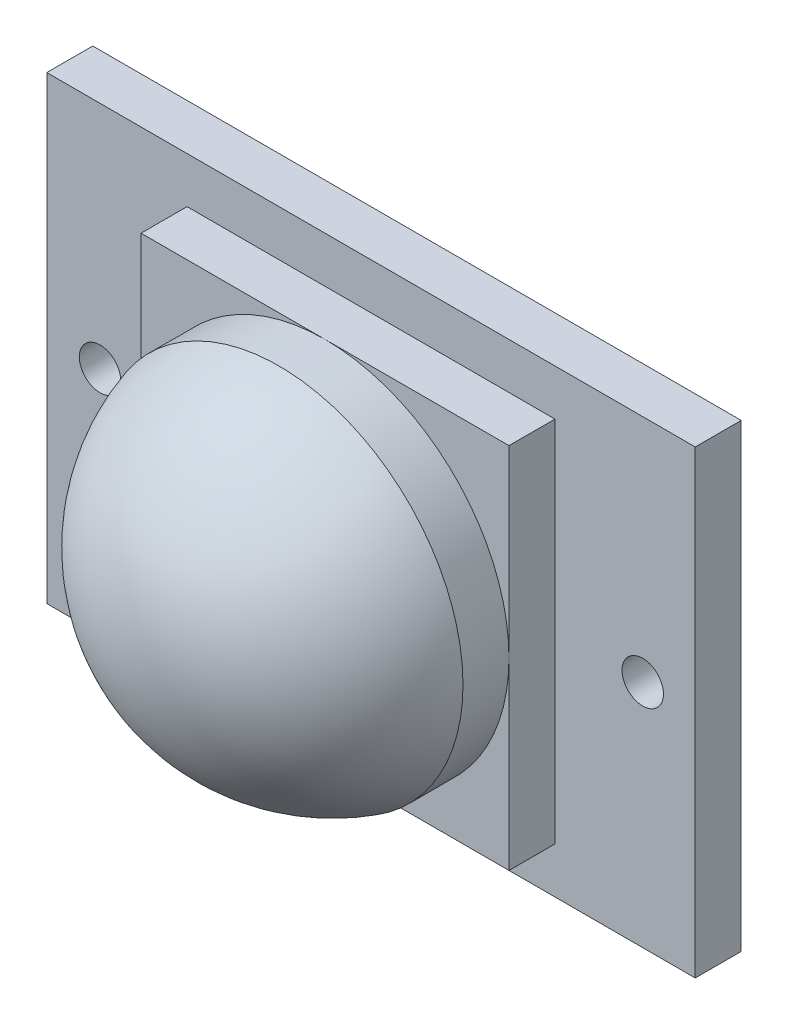
ISO-10303-21;
HEADER;
FILE_DESCRIPTION(('STEP AP214'),'2;1');
FILE_NAME('part.step','',(''),(''),'','','');
FILE_SCHEMA(('AUTOMOTIVE_DESIGN { 1 0 10303 214 1 1 1 1 }'));
ENDSEC;
DATA;
#1=APPLICATION_CONTEXT('core data for automotive mechanical design processes');
#2=APPLICATION_PROTOCOL_DEFINITION('international standard','automotive_design',2000,#1);
#3=PRODUCT_CONTEXT('',#1,'mechanical');
#4=PRODUCT('Part','Part','',(#3));
#5=PRODUCT_RELATED_PRODUCT_CATEGORY('part','',(#4));
#6=PRODUCT_DEFINITION_FORMATION('','',#4);
#7=PRODUCT_DEFINITION_CONTEXT('part definition',#1,'design');
#8=PRODUCT_DEFINITION('design','',#6,#7);
#9=PRODUCT_DEFINITION_SHAPE('','',#8);
#10=(LENGTH_UNIT() NAMED_UNIT(*) SI_UNIT(.MILLI.,.METRE.));
#11=(NAMED_UNIT(*) PLANE_ANGLE_UNIT() SI_UNIT($,.RADIAN.));
#12=(NAMED_UNIT(*) SI_UNIT($,.STERADIAN.) SOLID_ANGLE_UNIT());
#13=UNCERTAINTY_MEASURE_WITH_UNIT(LENGTH_MEASURE(1.E-05),#10,'distance_accuracy_value','');
#14=(GEOMETRIC_REPRESENTATION_CONTEXT(3) GLOBAL_UNCERTAINTY_ASSIGNED_CONTEXT((#13)) GLOBAL_UNIT_ASSIGNED_CONTEXT((#10,
#11,#12)) REPRESENTATION_CONTEXT('',''));
#15=CARTESIAN_POINT('',(0.,0.,0.));
#16=DIRECTION('',(0.,0.,1.));
#17=DIRECTION('',(1.,0.,0.));
#18=AXIS2_PLACEMENT_3D('',#15,#16,#17);
#19=CARTESIAN_POINT('',(0.,0.,5.08));
#20=DIRECTION('',(0.,0.,1.));
#21=DIRECTION('',(1.,0.,0.));
#22=AXIS2_PLACEMENT_3D('',#19,#20,#21);
#23=PLANE('',#22);
#24=CARTESIAN_POINT('',(17.907,12.7,5.08));
#25=DIRECTION('',(0.,0.,1.));
#26=DIRECTION('',(1.,0.,0.));
#27=AXIS2_PLACEMENT_3D('',#24,#25,#26);
#28=CIRCLE('',#27,10.16);
#29=CARTESIAN_POINT('',(28.067,12.7,5.08));
#30=VERTEX_POINT('',#29);
#31=CARTESIAN_POINT('',(17.907,22.86,5.08));
#32=VERTEX_POINT('',#31);
#33=EDGE_CURVE('E43',#30,#32,#28,.T.);
#34=ORIENTED_EDGE('',*,*,#33,.F.);
#35=DIRECTION('',(0.,1.,0.));
#36=VECTOR('',#35,1.);
#37=CARTESIAN_POINT('',(28.067,22.86,5.08));
#38=LINE('',#37,#36);
#39=CARTESIAN_POINT('',(28.067,22.86,5.08));
#40=VERTEX_POINT('',#39);
#41=EDGE_CURVE('E117',#30,#40,#38,.T.);
#42=ORIENTED_EDGE('',*,*,#41,.T.);
#43=DIRECTION('',(-1.,0.,0.));
#44=VECTOR('',#43,1.);
#45=CARTESIAN_POINT('',(7.74699999999998,22.86,5.08));
#46=LINE('',#45,#44);
#47=EDGE_CURVE('E130',#40,#32,#46,.T.);
#48=ORIENTED_EDGE('',*,*,#47,.T.);
#49=EDGE_LOOP('',(#34,#42,#48));
#50=FACE_BOUND('',#49,.T.);
#51=ADVANCED_FACE('F32',(#50),#23,.T.);
#52=CARTESIAN_POINT('',(7.74699999999998,12.7,5.08));
#53=VERTEX_POINT('',#52);
#54=EDGE_CURVE('E11',#32,#53,#28,.T.);
#55=ORIENTED_EDGE('',*,*,#54,.F.);
#56=CARTESIAN_POINT('',(7.74699999999998,22.86,5.08));
#57=VERTEX_POINT('',#56);
#58=EDGE_CURVE('E116',#32,#57,#46,.T.);
#59=ORIENTED_EDGE('',*,*,#58,.T.);
#60=DIRECTION('',(0.,-1.,0.));
#61=VECTOR('',#60,1.);
#62=CARTESIAN_POINT('',(7.74699999999998,22.86,5.08));
#63=LINE('',#62,#61);
#64=EDGE_CURVE('E138',#57,#53,#63,.T.);
#65=ORIENTED_EDGE('',*,*,#64,.T.);
#66=EDGE_LOOP('',(#55,#59,#65));
#67=FACE_BOUND('',#66,.T.);
#68=ADVANCED_FACE('F232',(#67),#23,.T.);
#69=CARTESIAN_POINT('',(17.907,2.54,5.08));
#70=VERTEX_POINT('',#69);
#71=EDGE_CURVE('E41',#53,#70,#28,.T.);
#72=ORIENTED_EDGE('',*,*,#71,.F.);
#73=CARTESIAN_POINT('',(7.74699999999999,2.53999999999999,5.08));
#74=VERTEX_POINT('',#73);
#75=EDGE_CURVE('E140',#53,#74,#63,.T.);
#76=ORIENTED_EDGE('',*,*,#75,.T.);
#77=DIRECTION('',(1.,0.,0.));
#78=VECTOR('',#77,1.);
#79=CARTESIAN_POINT('',(7.74699999999999,2.53999999999999,5.08));
#80=LINE('',#79,#78);
#81=EDGE_CURVE('E128',#74,#70,#80,.T.);
#82=ORIENTED_EDGE('',*,*,#81,.T.);
#83=EDGE_LOOP('',(#72,#76,#82));
#84=FACE_BOUND('',#83,.T.);
#85=ADVANCED_FACE('F237',(#84),#23,.T.);
#86=CARTESIAN_POINT('',(0.,0.,2.54));
#87=DIRECTION('',(0.,0.,-1.));
#88=DIRECTION('',(-1.,0.,0.));
#89=AXIS2_PLACEMENT_3D('',#86,#87,#88);
#90=PLANE('',#89);
#91=DIRECTION('',(0.,-1.,0.));
#92=VECTOR('',#91,1.);
#93=CARTESIAN_POINT('',(0.,0.,2.54));
#94=LINE('',#93,#92);
#95=CARTESIAN_POINT('',(0.,25.4,2.54));
#96=VERTEX_POINT('',#95);
#97=CARTESIAN_POINT('',(0.,0.,2.54));
#98=VERTEX_POINT('',#97);
#99=EDGE_CURVE('E177',#96,#98,#94,.T.);
#100=ORIENTED_EDGE('',*,*,#99,.T.);
#101=DIRECTION('',(1.,0.,0.));
#102=VECTOR('',#101,1.);
#103=CARTESIAN_POINT('',(0.,0.,2.54));
#104=LINE('',#103,#102);
#105=CARTESIAN_POINT('',(35.814,0.,2.54));
#106=VERTEX_POINT('',#105);
#107=EDGE_CURVE('E180',#98,#106,#104,.T.);
#108=ORIENTED_EDGE('',*,*,#107,.T.);
#109=DIRECTION('',(0.,1.,0.));
#110=VECTOR('',#109,1.);
#111=CARTESIAN_POINT('',(35.814,0.,2.54));
#112=LINE('',#111,#110);
#113=CARTESIAN_POINT('',(35.814,25.4,2.54));
#114=VERTEX_POINT('',#113);
#115=EDGE_CURVE('E183',#106,#114,#112,.T.);
#116=ORIENTED_EDGE('',*,*,#115,.T.);
#117=DIRECTION('',(-1.,0.,0.));
#118=VECTOR('',#117,1.);
#119=CARTESIAN_POINT('',(0.,25.4,2.54));
#120=LINE('',#119,#118);
#121=EDGE_CURVE('E185',#114,#96,#120,.T.);
#122=ORIENTED_EDGE('',*,*,#121,.T.);
#123=EDGE_LOOP('',(#100,#108,#116,#122));
#124=FACE_BOUND('',#123,.T.);
#125=CARTESIAN_POINT('',(2.942,12.7,2.54));
#126=DIRECTION('',(0.,0.,1.));
#127=DIRECTION('',(1.,0.,0.));
#128=AXIS2_PLACEMENT_3D('',#125,#126,#127);
#129=CIRCLE('',#128,1.143);
#130=CARTESIAN_POINT('',(4.085,12.7,2.54));
#131=VERTEX_POINT('',#130);
#132=EDGE_CURVE('E168',#131,#131,#129,.T.);
#133=ORIENTED_EDGE('',*,*,#132,.F.);
#134=EDGE_LOOP('',(#133));
#135=FACE_BOUND('',#134,.T.);
#136=CARTESIAN_POINT('',(32.914,12.7,2.54));
#137=DIRECTION('',(0.,0.,1.));
#138=DIRECTION('',(1.,0.,0.));
#139=AXIS2_PLACEMENT_3D('',#136,#137,#138);
#140=CIRCLE('',#139,1.143);
#141=CARTESIAN_POINT('',(34.057,12.7,2.54));
#142=VERTEX_POINT('',#141);
#143=EDGE_CURVE('E164',#142,#142,#140,.T.);
#144=ORIENTED_EDGE('',*,*,#143,.F.);
#145=EDGE_LOOP('',(#144));
#146=FACE_BOUND('',#145,.T.);
#147=DIRECTION('',(0.,-1.,0.));
#148=VECTOR('',#147,1.);
#149=CARTESIAN_POINT('',(7.74699999999998,22.86,2.54));
#150=LINE('',#149,#148);
#151=CARTESIAN_POINT('',(7.74699999999998,22.86,2.54));
#152=VERTEX_POINT('',#151);
#153=CARTESIAN_POINT('',(7.74699999999999,2.53999999999999,2.54));
#154=VERTEX_POINT('',#153);
#155=EDGE_CURVE('E145',#152,#154,#150,.T.);
#156=ORIENTED_EDGE('',*,*,#155,.F.);
#157=DIRECTION('',(-1.,0.,0.));
#158=VECTOR('',#157,1.);
#159=CARTESIAN_POINT('',(7.74699999999998,22.86,2.54));
#160=LINE('',#159,#158);
#161=CARTESIAN_POINT('',(28.067,22.86,2.54));
#162=VERTEX_POINT('',#161);
#163=EDGE_CURVE('E153',#162,#152,#160,.T.);
#164=ORIENTED_EDGE('',*,*,#163,.F.);
#165=DIRECTION('',(0.,1.,0.));
#166=VECTOR('',#165,1.);
#167=CARTESIAN_POINT('',(28.067,22.86,2.54));
#168=LINE('',#167,#166);
#169=CARTESIAN_POINT('',(28.067,2.54,2.54));
#170=VERTEX_POINT('',#169);
#171=EDGE_CURVE('E151',#170,#162,#168,.T.);
#172=ORIENTED_EDGE('',*,*,#171,.F.);
#173=DIRECTION('',(1.,0.,0.));
#174=VECTOR('',#173,1.);
#175=CARTESIAN_POINT('',(7.74699999999999,2.53999999999999,2.54));
#176=LINE('',#175,#174);
#177=EDGE_CURVE('E148',#154,#170,#176,.T.);
#178=ORIENTED_EDGE('',*,*,#177,.F.);
#179=EDGE_LOOP('',(#156,#164,#172,#178));
#180=FACE_BOUND('',#179,.T.);
#181=ADVANCED_FACE('F221',(#124,#135,#146,#180),#90,.F.);
#182=CARTESIAN_POINT('',(0.,0.,2.54));
#183=DIRECTION('',(1.,0.,0.));
#184=DIRECTION('',(0.,1.,0.));
#185=AXIS2_PLACEMENT_3D('',#182,#183,#184);
#186=PLANE('',#185);
#187=DIRECTION('',(0.,-1.,0.));
#188=VECTOR('',#187,1.);
#189=CARTESIAN_POINT('',(0.,0.,0.));
#190=LINE('',#189,#188);
#191=CARTESIAN_POINT('',(0.,25.4,0.));
#192=VERTEX_POINT('',#191);
#193=CARTESIAN_POINT('',(0.,0.,0.));
#194=VERTEX_POINT('',#193);
#195=EDGE_CURVE('E174',#192,#194,#190,.T.);
#196=ORIENTED_EDGE('',*,*,#195,.T.);
#197=DIRECTION('',(0.,0.,-1.));
#198=VECTOR('',#197,1.);
#199=CARTESIAN_POINT('',(0.,0.,2.54));
#200=LINE('',#199,#198);
#201=EDGE_CURVE('E134',#98,#194,#200,.T.);
#202=ORIENTED_EDGE('',*,*,#201,.F.);
#203=ORIENTED_EDGE('',*,*,#99,.F.);
#204=DIRECTION('',(0.,0.,-1.));
#205=VECTOR('',#204,1.);
#206=CARTESIAN_POINT('',(0.,25.4,2.54));
#207=LINE('',#206,#205);
#208=EDGE_CURVE('E187',#96,#192,#207,.T.);
#209=ORIENTED_EDGE('',*,*,#208,.T.);
#210=EDGE_LOOP('',(#196,#202,#203,#209));
#211=FACE_BOUND('',#210,.T.);
#212=ADVANCED_FACE('F218',(#211),#186,.F.);
#213=CARTESIAN_POINT('',(0.,0.,2.54));
#214=DIRECTION('',(0.,1.,0.));
#215=DIRECTION('',(0.,0.,1.));
#216=AXIS2_PLACEMENT_3D('',#213,#214,#215);
#217=PLANE('',#216);
#218=DIRECTION('',(1.,0.,0.));
#219=VECTOR('',#218,1.);
#220=CARTESIAN_POINT('',(0.,0.,0.));
#221=LINE('',#220,#219);
#222=CARTESIAN_POINT('',(35.814,0.,0.));
#223=VERTEX_POINT('',#222);
#224=EDGE_CURVE('E190',#194,#223,#221,.T.);
#225=ORIENTED_EDGE('',*,*,#224,.T.);
#226=DIRECTION('',(0.,0.,-1.));
#227=VECTOR('',#226,1.);
#228=CARTESIAN_POINT('',(35.814,0.,2.54));
#229=LINE('',#228,#227);
#230=EDGE_CURVE('E136',#106,#223,#229,.T.);
#231=ORIENTED_EDGE('',*,*,#230,.F.);
#232=ORIENTED_EDGE('',*,*,#107,.F.);
#233=ORIENTED_EDGE('',*,*,#201,.T.);
#234=EDGE_LOOP('',(#225,#231,#232,#233));
#235=FACE_BOUND('',#234,.T.);
#236=ADVANCED_FACE('F223',(#235),#217,.F.);
#237=CARTESIAN_POINT('',(35.814,0.,2.54));
#238=DIRECTION('',(-1.,0.,0.));
#239=DIRECTION('',(0.,-1.,0.));
#240=AXIS2_PLACEMENT_3D('',#237,#238,#239);
#241=PLANE('',#240);
#242=DIRECTION('',(0.,1.,0.));
#243=VECTOR('',#242,1.);
#244=CARTESIAN_POINT('',(35.814,0.,0.));
#245=LINE('',#244,#243);
#246=CARTESIAN_POINT('',(35.814,25.4,0.));
#247=VERTEX_POINT('',#246);
#248=EDGE_CURVE('E192',#223,#247,#245,.T.);
#249=ORIENTED_EDGE('',*,*,#248,.T.);
#250=DIRECTION('',(0.,0.,-1.));
#251=VECTOR('',#250,1.);
#252=CARTESIAN_POINT('',(35.814,25.4,2.54));
#253=LINE('',#252,#251);
#254=EDGE_CURVE('E197',#114,#247,#253,.T.);
#255=ORIENTED_EDGE('',*,*,#254,.F.);
#256=ORIENTED_EDGE('',*,*,#115,.F.);
#257=ORIENTED_EDGE('',*,*,#230,.T.);
#258=EDGE_LOOP('',(#249,#255,#256,#257));
#259=FACE_BOUND('',#258,.T.);
#260=ADVANCED_FACE('F205',(#259),#241,.F.);
#261=CARTESIAN_POINT('',(0.,25.4,2.54));
#262=DIRECTION('',(0.,-1.,0.));
#263=DIRECTION('',(0.,0.,-1.));
#264=AXIS2_PLACEMENT_3D('',#261,#262,#263);
#265=PLANE('',#264);
#266=DIRECTION('',(-1.,0.,0.));
#267=VECTOR('',#266,1.);
#268=CARTESIAN_POINT('',(0.,25.4,0.));
#269=LINE('',#268,#267);
#270=EDGE_CURVE('E181',#247,#192,#269,.T.);
#271=ORIENTED_EDGE('',*,*,#270,.T.);
#272=ORIENTED_EDGE('',*,*,#208,.F.);
#273=ORIENTED_EDGE('',*,*,#121,.F.);
#274=ORIENTED_EDGE('',*,*,#254,.T.);
#275=EDGE_LOOP('',(#271,#272,#273,#274));
#276=FACE_BOUND('',#275,.T.);
#277=ADVANCED_FACE('F214',(#276),#265,.F.);
#278=CARTESIAN_POINT('',(0.,0.,0.));
#279=DIRECTION('',(0.,0.,-1.));
#280=DIRECTION('',(-1.,0.,0.));
#281=AXIS2_PLACEMENT_3D('',#278,#279,#280);
#282=PLANE('',#281);
#283=CARTESIAN_POINT('',(32.914,12.7,0.));
#284=DIRECTION('',(0.,0.,1.));
#285=DIRECTION('',(1.,0.,0.));
#286=AXIS2_PLACEMENT_3D('',#283,#284,#285);
#287=CIRCLE('',#286,1.143);
#288=CARTESIAN_POINT('',(34.057,12.7,0.));
#289=VERTEX_POINT('',#288);
#290=EDGE_CURVE('E165',#289,#289,#287,.T.);
#291=ORIENTED_EDGE('',*,*,#290,.T.);
#292=EDGE_LOOP('',(#291));
#293=FACE_BOUND('',#292,.T.);
#294=CARTESIAN_POINT('',(2.942,12.7,0.));
#295=DIRECTION('',(0.,0.,1.));
#296=DIRECTION('',(1.,0.,0.));
#297=AXIS2_PLACEMENT_3D('',#294,#295,#296);
#298=CIRCLE('',#297,1.143);
#299=CARTESIAN_POINT('',(4.085,12.7,0.));
#300=VERTEX_POINT('',#299);
#301=EDGE_CURVE('E171',#300,#300,#298,.T.);
#302=ORIENTED_EDGE('',*,*,#301,.T.);
#303=EDGE_LOOP('',(#302));
#304=FACE_BOUND('',#303,.T.);
#305=ORIENTED_EDGE('',*,*,#195,.F.);
#306=ORIENTED_EDGE('',*,*,#270,.F.);
#307=ORIENTED_EDGE('',*,*,#248,.F.);
#308=ORIENTED_EDGE('',*,*,#224,.F.);
#309=EDGE_LOOP('',(#305,#306,#307,#308));
#310=FACE_BOUND('',#309,.T.);
#311=ADVANCED_FACE('F211',(#293,#304,#310),#282,.T.);
#312=CARTESIAN_POINT('',(2.942,12.7,0.));
#313=DIRECTION('',(0.,0.,1.));
#314=DIRECTION('',(1.,0.,0.));
#315=AXIS2_PLACEMENT_3D('',#312,#313,#314);
#316=CYLINDRICAL_SURFACE('',#315,1.143);
#317=ORIENTED_EDGE('',*,*,#301,.F.);
#318=EDGE_LOOP('',(#317));
#319=FACE_BOUND('',#318,.T.);
#320=ORIENTED_EDGE('',*,*,#132,.T.);
#321=EDGE_LOOP('',(#320));
#322=FACE_BOUND('',#321,.T.);
#323=ADVANCED_FACE('F276',(#319,#322),#316,.F.);
#324=CARTESIAN_POINT('',(32.914,12.7,0.));
#325=DIRECTION('',(0.,0.,1.));
#326=DIRECTION('',(1.,0.,0.));
#327=AXIS2_PLACEMENT_3D('',#324,#325,#326);
#328=CYLINDRICAL_SURFACE('',#327,1.143);
#329=ORIENTED_EDGE('',*,*,#290,.F.);
#330=EDGE_LOOP('',(#329));
#331=FACE_BOUND('',#330,.T.);
#332=ORIENTED_EDGE('',*,*,#143,.T.);
#333=EDGE_LOOP('',(#332));
#334=FACE_BOUND('',#333,.T.);
#335=ADVANCED_FACE('F271',(#331,#334),#328,.F.);
#336=CARTESIAN_POINT('',(7.74699999999998,22.86,5.08));
#337=DIRECTION('',(1.,0.,0.));
#338=DIRECTION('',(0.,1.,0.));
#339=AXIS2_PLACEMENT_3D('',#336,#337,#338);
#340=PLANE('',#339);
#341=ORIENTED_EDGE('',*,*,#155,.T.);
#342=DIRECTION('',(0.,0.,-1.));
#343=VECTOR('',#342,1.);
#344=CARTESIAN_POINT('',(7.74699999999999,2.53999999999999,5.08));
#345=LINE('',#344,#343);
#346=EDGE_CURVE('E161',#74,#154,#345,.T.);
#347=ORIENTED_EDGE('',*,*,#346,.F.);
#348=ORIENTED_EDGE('',*,*,#75,.F.);
#349=ORIENTED_EDGE('',*,*,#64,.F.);
#350=DIRECTION('',(0.,0.,-1.));
#351=VECTOR('',#350,1.);
#352=CARTESIAN_POINT('',(7.74699999999998,22.86,5.08));
#353=LINE('',#352,#351);
#354=EDGE_CURVE('E144',#57,#152,#353,.T.);
#355=ORIENTED_EDGE('',*,*,#354,.T.);
#356=EDGE_LOOP('',(#341,#347,#348,#349,#355));
#357=FACE_BOUND('',#356,.T.);
#358=ADVANCED_FACE('F259',(#357),#340,.F.);
#359=CARTESIAN_POINT('',(7.74699999999999,2.53999999999999,5.08));
#360=DIRECTION('',(0.,1.,0.));
#361=DIRECTION('',(-1.,0.,0.));
#362=AXIS2_PLACEMENT_3D('',#359,#360,#361);
#363=PLANE('',#362);
#364=ORIENTED_EDGE('',*,*,#177,.T.);
#365=DIRECTION('',(0.,0.,-1.));
#366=VECTOR('',#365,1.);
#367=CARTESIAN_POINT('',(28.067,2.54,5.08));
#368=LINE('',#367,#366);
#369=CARTESIAN_POINT('',(28.067,2.54,5.08));
#370=VERTEX_POINT('',#369);
#371=EDGE_CURVE('E159',#370,#170,#368,.T.);
#372=ORIENTED_EDGE('',*,*,#371,.F.);
#373=EDGE_CURVE('E112',#70,#370,#80,.T.);
#374=ORIENTED_EDGE('',*,*,#373,.F.);
#375=ORIENTED_EDGE('',*,*,#81,.F.);
#376=ORIENTED_EDGE('',*,*,#346,.T.);
#377=EDGE_LOOP('',(#364,#372,#374,#375,#376));
#378=FACE_BOUND('',#377,.T.);
#379=ADVANCED_FACE('F263',(#378),#363,.F.);
#380=CARTESIAN_POINT('',(28.067,22.86,5.08));
#381=DIRECTION('',(-1.,0.,0.));
#382=DIRECTION('',(0.,0.,1.));
#383=AXIS2_PLACEMENT_3D('',#380,#381,#382);
#384=PLANE('',#383);
#385=ORIENTED_EDGE('',*,*,#171,.T.);
#386=DIRECTION('',(0.,0.,-1.));
#387=VECTOR('',#386,1.);
#388=CARTESIAN_POINT('',(28.067,22.86,5.08));
#389=LINE('',#388,#387);
#390=EDGE_CURVE('E124',#40,#162,#389,.T.);
#391=ORIENTED_EDGE('',*,*,#390,.F.);
#392=ORIENTED_EDGE('',*,*,#41,.F.);
#393=EDGE_CURVE('E109',#370,#30,#38,.T.);
#394=ORIENTED_EDGE('',*,*,#393,.F.);
#395=ORIENTED_EDGE('',*,*,#371,.T.);
#396=EDGE_LOOP('',(#385,#391,#392,#394,#395));
#397=FACE_BOUND('',#396,.T.);
#398=ADVANCED_FACE('F122',(#397),#384,.F.);
#399=CARTESIAN_POINT('',(7.74699999999998,22.86,5.08));
#400=DIRECTION('',(0.,-1.,0.));
#401=DIRECTION('',(1.,0.,0.));
#402=AXIS2_PLACEMENT_3D('',#399,#400,#401);
#403=PLANE('',#402);
#404=ORIENTED_EDGE('',*,*,#163,.T.);
#405=ORIENTED_EDGE('',*,*,#354,.F.);
#406=ORIENTED_EDGE('',*,*,#58,.F.);
#407=ORIENTED_EDGE('',*,*,#47,.F.);
#408=ORIENTED_EDGE('',*,*,#390,.T.);
#409=EDGE_LOOP('',(#404,#405,#406,#407,#408));
#410=FACE_BOUND('',#409,.T.);
#411=ADVANCED_FACE('F241',(#410),#403,.F.);
#412=EDGE_CURVE('E56',#70,#30,#28,.T.);
#413=ORIENTED_EDGE('',*,*,#412,.F.);
#414=ORIENTED_EDGE('',*,*,#373,.T.);
#415=ORIENTED_EDGE('',*,*,#393,.T.);
#416=EDGE_LOOP('',(#413,#414,#415));
#417=FACE_BOUND('',#416,.T.);
#418=ADVANCED_FACE('F111',(#417),#23,.T.);
#419=CARTESIAN_POINT('',(17.907,12.7,7.61999999999999));
#420=DIRECTION('',(0.,0.,-1.));
#421=DIRECTION('',(-1.,0.,0.));
#422=AXIS2_PLACEMENT_3D('',#419,#420,#421);
#423=CYLINDRICAL_SURFACE('',#422,10.16);
#424=CARTESIAN_POINT('',(17.907,12.7,7.61999999999999));
#425=DIRECTION('',(0.,0.,1.));
#426=DIRECTION('',(1.,0.,0.));
#427=AXIS2_PLACEMENT_3D('',#424,#425,#426);
#428=CIRCLE('',#427,10.16);
#429=CARTESIAN_POINT('',(28.067,12.7,7.61999999999999));
#430=VERTEX_POINT('',#429);
#431=EDGE_CURVE('E36',#430,#430,#428,.T.);
#432=ORIENTED_EDGE('',*,*,#431,.F.);
#433=EDGE_LOOP('',(#432));
#434=FACE_BOUND('',#433,.T.);
#435=ORIENTED_EDGE('',*,*,#33,.T.);
#436=ORIENTED_EDGE('',*,*,#54,.T.);
#437=ORIENTED_EDGE('',*,*,#71,.T.);
#438=ORIENTED_EDGE('',*,*,#412,.T.);
#439=EDGE_LOOP('',(#435,#436,#437,#438));
#440=FACE_BOUND('',#439,.T.);
#441=ADVANCED_FACE('F133',(#434,#440),#423,.T.);
#442=CARTESIAN_POINT('',(17.907,12.7,4.65666666666665));
#443=DIRECTION('',(0.,0.,1.));
#444=DIRECTION('',(1.,0.,0.));
#445=AXIS2_PLACEMENT_3D('',#442,#443,#444);
#446=SPHERICAL_SURFACE('',#445,10.5833333333333);
#447=ORIENTED_EDGE('',*,*,#431,.T.);
#448=EDGE_LOOP('',(#447));
#449=FACE_BOUND('',#448,.T.);
#450=ADVANCED_FACE('F34',(#449),#446,.T.);
#451=CLOSED_SHELL('',(#51,#68,#85,#181,#212,#236,#260,#277,#311,#323,#335,#358,#379,#398,#411,
#418,#441,#450));
#452=MANIFOLD_SOLID_BREP('B2',#451);
#453=ADVANCED_BREP_SHAPE_REPRESENTATION('',(#18,#452),#14);
#454=SHAPE_DEFINITION_REPRESENTATION(#9,#453);
ENDSEC;
END-ISO-10303-21;
